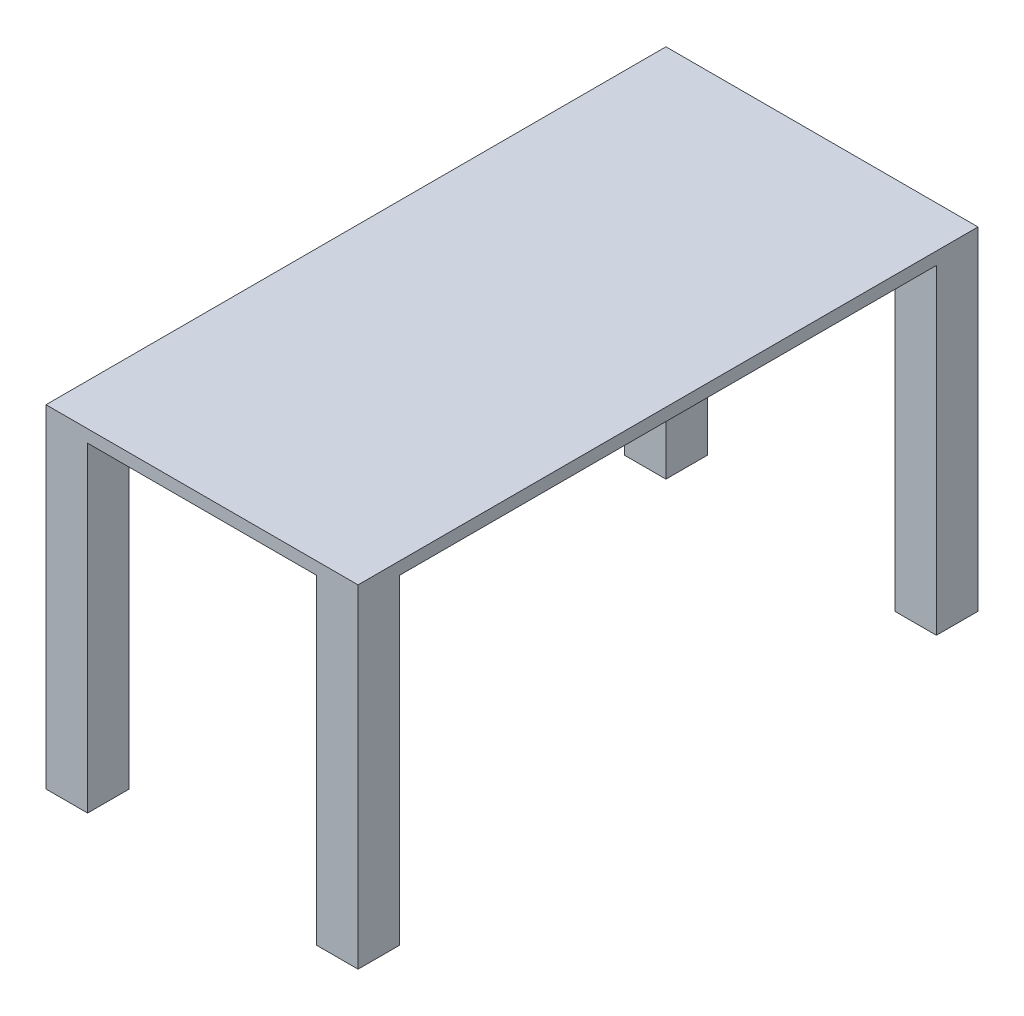
ISO-10303-21;
HEADER;
FILE_DESCRIPTION(('STEP AP214'),'2;1');
FILE_NAME('part.step','',(''),(''),'','','');
FILE_SCHEMA(('AUTOMOTIVE_DESIGN { 1 0 10303 214 1 1 1 1 }'));
ENDSEC;
DATA;
#1=APPLICATION_CONTEXT('core data for automotive mechanical design processes');
#2=APPLICATION_PROTOCOL_DEFINITION('international standard','automotive_design',2000,#1);
#3=PRODUCT_CONTEXT('',#1,'mechanical');
#4=PRODUCT('Part','Part','',(#3));
#5=PRODUCT_RELATED_PRODUCT_CATEGORY('part','',(#4));
#6=PRODUCT_DEFINITION_FORMATION('','',#4);
#7=PRODUCT_DEFINITION_CONTEXT('part definition',#1,'design');
#8=PRODUCT_DEFINITION('design','',#6,#7);
#9=PRODUCT_DEFINITION_SHAPE('','',#8);
#10=(LENGTH_UNIT() NAMED_UNIT(*) SI_UNIT(.MILLI.,.METRE.));
#11=(NAMED_UNIT(*) PLANE_ANGLE_UNIT() SI_UNIT($,.RADIAN.));
#12=(NAMED_UNIT(*) SI_UNIT($,.STERADIAN.) SOLID_ANGLE_UNIT());
#13=UNCERTAINTY_MEASURE_WITH_UNIT(LENGTH_MEASURE(1.E-05),#10,'distance_accuracy_value','');
#14=(GEOMETRIC_REPRESENTATION_CONTEXT(3) GLOBAL_UNCERTAINTY_ASSIGNED_CONTEXT((#13)) GLOBAL_UNIT_ASSIGNED_CONTEXT((#10,
#11,#12)) REPRESENTATION_CONTEXT('',''));
#15=CARTESIAN_POINT('',(0.,0.,0.));
#16=DIRECTION('',(0.,0.,1.));
#17=DIRECTION('',(1.,0.,0.));
#18=AXIS2_PLACEMENT_3D('',#15,#16,#17);
#19=CARTESIAN_POINT('',(0.,30.,0.));
#20=DIRECTION('',(1.,0.,0.));
#21=DIRECTION('',(0.,0.,-1.));
#22=AXIS2_PLACEMENT_3D('',#19,#20,#21);
#23=PLANE('',#22);
#24=DIRECTION('',(0.,-1.,0.));
#25=VECTOR('',#24,1.);
#26=CARTESIAN_POINT('',(0.,30.,0.));
#27=LINE('',#26,#25);
#28=CARTESIAN_POINT('',(0.,30.,0.));
#29=VERTEX_POINT('',#28);
#30=CARTESIAN_POINT('',(0.,-770.,0.));
#31=VERTEX_POINT('',#30);
#32=EDGE_CURVE('E255',#29,#31,#27,.T.);
#33=ORIENTED_EDGE('',*,*,#32,.F.);
#34=DIRECTION('',(0.,0.,1.));
#35=VECTOR('',#34,1.);
#36=CARTESIAN_POINT('',(0.,30.,0.));
#37=LINE('',#36,#35);
#38=CARTESIAN_POINT('',(0.,30.,-1490.));
#39=VERTEX_POINT('',#38);
#40=EDGE_CURVE('E152',#39,#29,#37,.T.);
#41=ORIENTED_EDGE('',*,*,#40,.F.);
#42=DIRECTION('',(0.,-1.,0.));
#43=VECTOR('',#42,1.);
#44=CARTESIAN_POINT('',(0.,30.,-1490.));
#45=LINE('',#44,#43);
#46=CARTESIAN_POINT('',(0.,-770.,-1490.));
#47=VERTEX_POINT('',#46);
#48=EDGE_CURVE('E148',#39,#47,#45,.T.);
#49=ORIENTED_EDGE('',*,*,#48,.T.);
#50=DIRECTION('',(0.,0.,1.));
#51=VECTOR('',#50,1.);
#52=CARTESIAN_POINT('',(0.,-770.,-1490.));
#53=LINE('',#52,#51);
#54=CARTESIAN_POINT('',(0.,-770.,-1390.));
#55=VERTEX_POINT('',#54);
#56=EDGE_CURVE('E151',#47,#55,#53,.T.);
#57=ORIENTED_EDGE('',*,*,#56,.T.);
#58=DIRECTION('',(0.,1.,0.));
#59=VECTOR('',#58,1.);
#60=CARTESIAN_POINT('',(0.,-770.,-1390.));
#61=LINE('',#60,#59);
#62=CARTESIAN_POINT('',(0.,0.,-1390.));
#63=VERTEX_POINT('',#62);
#64=EDGE_CURVE('E51',#55,#63,#61,.T.);
#65=ORIENTED_EDGE('',*,*,#64,.T.);
#66=DIRECTION('',(0.,0.,1.));
#67=VECTOR('',#66,1.);
#68=CARTESIAN_POINT('',(0.,0.,0.));
#69=LINE('',#68,#67);
#70=CARTESIAN_POINT('',(0.,0.,-100.));
#71=VERTEX_POINT('',#70);
#72=EDGE_CURVE('E232',#63,#71,#69,.T.);
#73=ORIENTED_EDGE('',*,*,#72,.T.);
#74=DIRECTION('',(0.,1.,0.));
#75=VECTOR('',#74,1.);
#76=CARTESIAN_POINT('',(0.,-770.,-100.));
#77=LINE('',#76,#75);
#78=CARTESIAN_POINT('',(0.,-770.,-100.));
#79=VERTEX_POINT('',#78);
#80=EDGE_CURVE('E229',#79,#71,#77,.T.);
#81=ORIENTED_EDGE('',*,*,#80,.F.);
#82=DIRECTION('',(0.,0.,1.));
#83=VECTOR('',#82,1.);
#84=CARTESIAN_POINT('',(0.,-770.,0.));
#85=LINE('',#84,#83);
#86=EDGE_CURVE('E212',#79,#31,#85,.T.);
#87=ORIENTED_EDGE('',*,*,#86,.T.);
#88=EDGE_LOOP('',(#33,#41,#49,#57,#65,#73,#81,#87));
#89=FACE_BOUND('',#88,.T.);
#90=ADVANCED_FACE('F37',(#89),#23,.F.);
#91=CARTESIAN_POINT('',(0.,30.,0.));
#92=DIRECTION('',(0.,0.,-1.));
#93=DIRECTION('',(-1.,0.,0.));
#94=AXIS2_PLACEMENT_3D('',#91,#92,#93);
#95=PLANE('',#94);
#96=DIRECTION('',(1.,0.,0.));
#97=VECTOR('',#96,1.);
#98=CARTESIAN_POINT('',(0.,0.,0.));
#99=LINE('',#98,#97);
#100=CARTESIAN_POINT('',(100.,0.,0.));
#101=VERTEX_POINT('',#100);
#102=CARTESIAN_POINT('',(650.,0.,0.));
#103=VERTEX_POINT('',#102);
#104=EDGE_CURVE('E245',#101,#103,#99,.T.);
#105=ORIENTED_EDGE('',*,*,#104,.T.);
#106=DIRECTION('',(0.,1.,0.));
#107=VECTOR('',#106,1.);
#108=CARTESIAN_POINT('',(650.,-770.,0.));
#109=LINE('',#108,#107);
#110=CARTESIAN_POINT('',(650.,-770.,0.));
#111=VERTEX_POINT('',#110);
#112=EDGE_CURVE('E210',#111,#103,#109,.T.);
#113=ORIENTED_EDGE('',*,*,#112,.F.);
#114=DIRECTION('',(1.,0.,0.));
#115=VECTOR('',#114,1.);
#116=CARTESIAN_POINT('',(750.,-770.,0.));
#117=LINE('',#116,#115);
#118=CARTESIAN_POINT('',(750.,-770.,0.));
#119=VERTEX_POINT('',#118);
#120=EDGE_CURVE('E193',#111,#119,#117,.T.);
#121=ORIENTED_EDGE('',*,*,#120,.T.);
#122=DIRECTION('',(0.,-1.,0.));
#123=VECTOR('',#122,1.);
#124=CARTESIAN_POINT('',(750.,30.,0.));
#125=LINE('',#124,#123);
#126=CARTESIAN_POINT('',(750.,30.,0.));
#127=VERTEX_POINT('',#126);
#128=EDGE_CURVE('E253',#127,#119,#125,.T.);
#129=ORIENTED_EDGE('',*,*,#128,.F.);
#130=DIRECTION('',(1.,0.,0.));
#131=VECTOR('',#130,1.);
#132=CARTESIAN_POINT('',(0.,30.,0.));
#133=LINE('',#132,#131);
#134=EDGE_CURVE('E238',#29,#127,#133,.T.);
#135=ORIENTED_EDGE('',*,*,#134,.F.);
#136=ORIENTED_EDGE('',*,*,#32,.T.);
#137=DIRECTION('',(1.,0.,0.));
#138=VECTOR('',#137,1.);
#139=CARTESIAN_POINT('',(0.,-770.,0.));
#140=LINE('',#139,#138);
#141=CARTESIAN_POINT('',(100.,-770.,0.));
#142=VERTEX_POINT('',#141);
#143=EDGE_CURVE('E219',#31,#142,#140,.T.);
#144=ORIENTED_EDGE('',*,*,#143,.T.);
#145=DIRECTION('',(0.,1.,0.));
#146=VECTOR('',#145,1.);
#147=CARTESIAN_POINT('',(100.,-770.,0.));
#148=LINE('',#147,#146);
#149=EDGE_CURVE('E228',#142,#101,#148,.T.);
#150=ORIENTED_EDGE('',*,*,#149,.T.);
#151=EDGE_LOOP('',(#105,#113,#121,#129,#135,#136,#144,#150));
#152=FACE_BOUND('',#151,.T.);
#153=ADVANCED_FACE('F289',(#152),#95,.F.);
#154=CARTESIAN_POINT('',(750.,30.,0.));
#155=DIRECTION('',(-1.,0.,0.));
#156=DIRECTION('',(0.,0.,1.));
#157=AXIS2_PLACEMENT_3D('',#154,#155,#156);
#158=PLANE('',#157);
#159=DIRECTION('',(0.,0.,-1.));
#160=VECTOR('',#159,1.);
#161=CARTESIAN_POINT('',(750.,0.,0.));
#162=LINE('',#161,#160);
#163=CARTESIAN_POINT('',(750.,0.,-100.));
#164=VERTEX_POINT('',#163);
#165=CARTESIAN_POINT('',(750.,0.,-1390.));
#166=VERTEX_POINT('',#165);
#167=EDGE_CURVE('E248',#164,#166,#162,.T.);
#168=ORIENTED_EDGE('',*,*,#167,.T.);
#169=DIRECTION('',(0.,1.,0.));
#170=VECTOR('',#169,1.);
#171=CARTESIAN_POINT('',(750.,-770.,-1390.));
#172=LINE('',#171,#170);
#173=CARTESIAN_POINT('',(750.,-770.,-1390.));
#174=VERTEX_POINT('',#173);
#175=EDGE_CURVE('E191',#174,#166,#172,.T.);
#176=ORIENTED_EDGE('',*,*,#175,.F.);
#177=DIRECTION('',(0.,0.,-1.));
#178=VECTOR('',#177,1.);
#179=CARTESIAN_POINT('',(750.,-770.,-1490.));
#180=LINE('',#179,#178);
#181=CARTESIAN_POINT('',(750.,-770.,-1490.));
#182=VERTEX_POINT('',#181);
#183=EDGE_CURVE('E176',#174,#182,#180,.T.);
#184=ORIENTED_EDGE('',*,*,#183,.T.);
#185=DIRECTION('',(0.,-1.,0.));
#186=VECTOR('',#185,1.);
#187=CARTESIAN_POINT('',(750.,30.,-1490.));
#188=LINE('',#187,#186);
#189=CARTESIAN_POINT('',(750.,30.,-1490.));
#190=VERTEX_POINT('',#189);
#191=EDGE_CURVE('E155',#190,#182,#188,.T.);
#192=ORIENTED_EDGE('',*,*,#191,.F.);
#193=DIRECTION('',(0.,0.,-1.));
#194=VECTOR('',#193,1.);
#195=CARTESIAN_POINT('',(750.,30.,0.));
#196=LINE('',#195,#194);
#197=EDGE_CURVE('E241',#127,#190,#196,.T.);
#198=ORIENTED_EDGE('',*,*,#197,.F.);
#199=ORIENTED_EDGE('',*,*,#128,.T.);
#200=DIRECTION('',(0.,0.,-1.));
#201=VECTOR('',#200,1.);
#202=CARTESIAN_POINT('',(750.,-770.,0.));
#203=LINE('',#202,#201);
#204=CARTESIAN_POINT('',(750.,-770.,-100.));
#205=VERTEX_POINT('',#204);
#206=EDGE_CURVE('E200',#119,#205,#203,.T.);
#207=ORIENTED_EDGE('',*,*,#206,.T.);
#208=DIRECTION('',(0.,1.,0.));
#209=VECTOR('',#208,1.);
#210=CARTESIAN_POINT('',(750.,-770.,-100.));
#211=LINE('',#210,#209);
#212=EDGE_CURVE('E209',#205,#164,#211,.T.);
#213=ORIENTED_EDGE('',*,*,#212,.T.);
#214=EDGE_LOOP('',(#168,#176,#184,#192,#198,#199,#207,#213));
#215=FACE_BOUND('',#214,.T.);
#216=ADVANCED_FACE('F302',(#215),#158,.F.);
#217=CARTESIAN_POINT('',(0.,30.,-1490.));
#218=DIRECTION('',(0.,0.,1.));
#219=DIRECTION('',(1.,0.,0.));
#220=AXIS2_PLACEMENT_3D('',#217,#218,#219);
#221=PLANE('',#220);
#222=DIRECTION('',(-1.,0.,0.));
#223=VECTOR('',#222,1.);
#224=CARTESIAN_POINT('',(0.,0.,-1490.));
#225=LINE('',#224,#223);
#226=CARTESIAN_POINT('',(650.,0.,-1490.));
#227=VERTEX_POINT('',#226);
#228=CARTESIAN_POINT('',(99.9999999999999,0.,-1490.));
#229=VERTEX_POINT('',#228);
#230=EDGE_CURVE('E239',#227,#229,#225,.T.);
#231=ORIENTED_EDGE('',*,*,#230,.T.);
#232=DIRECTION('',(0.,1.,0.));
#233=VECTOR('',#232,1.);
#234=CARTESIAN_POINT('',(99.9999999999999,-770.,-1490.));
#235=LINE('',#234,#233);
#236=CARTESIAN_POINT('',(99.9999999999999,-770.,-1490.));
#237=VERTEX_POINT('',#236);
#238=EDGE_CURVE('E169',#237,#229,#235,.T.);
#239=ORIENTED_EDGE('',*,*,#238,.F.);
#240=DIRECTION('',(-1.,0.,0.));
#241=VECTOR('',#240,1.);
#242=CARTESIAN_POINT('',(0.,-770.,-1490.));
#243=LINE('',#242,#241);
#244=EDGE_CURVE('E163',#237,#47,#243,.T.);
#245=ORIENTED_EDGE('',*,*,#244,.T.);
#246=ORIENTED_EDGE('',*,*,#48,.F.);
#247=DIRECTION('',(-1.,0.,0.));
#248=VECTOR('',#247,1.);
#249=CARTESIAN_POINT('',(0.,30.,-1490.));
#250=LINE('',#249,#248);
#251=EDGE_CURVE('E156',#190,#39,#250,.T.);
#252=ORIENTED_EDGE('',*,*,#251,.F.);
#253=ORIENTED_EDGE('',*,*,#191,.T.);
#254=DIRECTION('',(-1.,0.,0.));
#255=VECTOR('',#254,1.);
#256=CARTESIAN_POINT('',(750.,-770.,-1490.));
#257=LINE('',#256,#255);
#258=CARTESIAN_POINT('',(650.,-770.,-1490.));
#259=VERTEX_POINT('',#258);
#260=EDGE_CURVE('E183',#182,#259,#257,.T.);
#261=ORIENTED_EDGE('',*,*,#260,.T.);
#262=DIRECTION('',(0.,1.,0.));
#263=VECTOR('',#262,1.);
#264=CARTESIAN_POINT('',(650.,-770.,-1490.));
#265=LINE('',#264,#263);
#266=EDGE_CURVE('E59',#259,#227,#265,.T.);
#267=ORIENTED_EDGE('',*,*,#266,.T.);
#268=EDGE_LOOP('',(#231,#239,#245,#246,#252,#253,#261,#267));
#269=FACE_BOUND('',#268,.T.);
#270=ADVANCED_FACE('F168',(#269),#221,.F.);
#271=CARTESIAN_POINT('',(0.,30.,0.));
#272=DIRECTION('',(0.,-1.,0.));
#273=DIRECTION('',(0.,0.,-1.));
#274=AXIS2_PLACEMENT_3D('',#271,#272,#273);
#275=PLANE('',#274);
#276=ORIENTED_EDGE('',*,*,#251,.T.);
#277=ORIENTED_EDGE('',*,*,#40,.T.);
#278=ORIENTED_EDGE('',*,*,#134,.T.);
#279=ORIENTED_EDGE('',*,*,#197,.T.);
#280=EDGE_LOOP('',(#276,#277,#278,#279));
#281=FACE_BOUND('',#280,.T.);
#282=ADVANCED_FACE('F293',(#281),#275,.F.);
#283=CARTESIAN_POINT('',(0.,0.,0.));
#284=DIRECTION('',(0.,-1.,0.));
#285=DIRECTION('',(0.,0.,-1.));
#286=AXIS2_PLACEMENT_3D('',#283,#284,#285);
#287=PLANE('',#286);
#288=DIRECTION('',(0.,0.,1.));
#289=VECTOR('',#288,1.);
#290=CARTESIAN_POINT('',(99.9999999999999,0.,0.));
#291=LINE('',#290,#289);
#292=CARTESIAN_POINT('',(99.9999999999999,0.,-1390.));
#293=VERTEX_POINT('',#292);
#294=EDGE_CURVE('E11',#229,#293,#291,.T.);
#295=ORIENTED_EDGE('',*,*,#294,.F.);
#296=ORIENTED_EDGE('',*,*,#230,.F.);
#297=DIRECTION('',(0.,0.,-1.));
#298=VECTOR('',#297,1.);
#299=CARTESIAN_POINT('',(650.,0.,0.));
#300=LINE('',#299,#298);
#301=CARTESIAN_POINT('',(650.,0.,-1390.));
#302=VERTEX_POINT('',#301);
#303=EDGE_CURVE('E267',#302,#227,#300,.T.);
#304=ORIENTED_EDGE('',*,*,#303,.F.);
#305=DIRECTION('',(-1.,0.,0.));
#306=VECTOR('',#305,1.);
#307=CARTESIAN_POINT('',(0.,0.,-1390.));
#308=LINE('',#307,#306);
#309=EDGE_CURVE('E269',#166,#302,#308,.T.);
#310=ORIENTED_EDGE('',*,*,#309,.F.);
#311=ORIENTED_EDGE('',*,*,#167,.F.);
#312=DIRECTION('',(1.,0.,0.));
#313=VECTOR('',#312,1.);
#314=CARTESIAN_POINT('',(0.,0.,-100.));
#315=LINE('',#314,#313);
#316=CARTESIAN_POINT('',(650.,0.,-100.));
#317=VERTEX_POINT('',#316);
#318=EDGE_CURVE('E262',#317,#164,#315,.T.);
#319=ORIENTED_EDGE('',*,*,#318,.F.);
#320=DIRECTION('',(0.,0.,-1.));
#321=VECTOR('',#320,1.);
#322=CARTESIAN_POINT('',(650.,0.,0.));
#323=LINE('',#322,#321);
#324=EDGE_CURVE('E265',#103,#317,#323,.T.);
#325=ORIENTED_EDGE('',*,*,#324,.F.);
#326=ORIENTED_EDGE('',*,*,#104,.F.);
#327=DIRECTION('',(0.,0.,1.));
#328=VECTOR('',#327,1.);
#329=CARTESIAN_POINT('',(100.,0.,0.));
#330=LINE('',#329,#328);
#331=CARTESIAN_POINT('',(100.,0.,-100.));
#332=VERTEX_POINT('',#331);
#333=EDGE_CURVE('E257',#332,#101,#330,.T.);
#334=ORIENTED_EDGE('',*,*,#333,.F.);
#335=DIRECTION('',(1.,0.,0.));
#336=VECTOR('',#335,1.);
#337=CARTESIAN_POINT('',(0.,0.,-100.));
#338=LINE('',#337,#336);
#339=EDGE_CURVE('E260',#71,#332,#338,.T.);
#340=ORIENTED_EDGE('',*,*,#339,.F.);
#341=ORIENTED_EDGE('',*,*,#72,.F.);
#342=DIRECTION('',(-1.,0.,0.));
#343=VECTOR('',#342,1.);
#344=CARTESIAN_POINT('',(0.,0.,-1390.));
#345=LINE('',#344,#343);
#346=EDGE_CURVE('E44',#293,#63,#345,.T.);
#347=ORIENTED_EDGE('',*,*,#346,.F.);
#348=EDGE_LOOP('',(#295,#296,#304,#310,#311,#319,#325,#326,#334,#340,#341,#347));
#349=FACE_BOUND('',#348,.T.);
#350=ADVANCED_FACE('F277',(#349),#287,.T.);
#351=CARTESIAN_POINT('',(0.,-770.,-100.));
#352=DIRECTION('',(0.,0.,-1.));
#353=DIRECTION('',(-1.,0.,0.));
#354=AXIS2_PLACEMENT_3D('',#351,#352,#353);
#355=PLANE('',#354);
#356=ORIENTED_EDGE('',*,*,#80,.T.);
#357=ORIENTED_EDGE('',*,*,#339,.T.);
#358=DIRECTION('',(0.,1.,0.));
#359=VECTOR('',#358,1.);
#360=CARTESIAN_POINT('',(100.,-770.,-100.));
#361=LINE('',#360,#359);
#362=CARTESIAN_POINT('',(100.,-770.,-100.));
#363=VERTEX_POINT('',#362);
#364=EDGE_CURVE('E233',#363,#332,#361,.T.);
#365=ORIENTED_EDGE('',*,*,#364,.F.);
#366=DIRECTION('',(-1.,0.,0.));
#367=VECTOR('',#366,1.);
#368=CARTESIAN_POINT('',(0.,-770.,-100.));
#369=LINE('',#368,#367);
#370=EDGE_CURVE('E225',#363,#79,#369,.T.);
#371=ORIENTED_EDGE('',*,*,#370,.T.);
#372=EDGE_LOOP('',(#356,#357,#365,#371));
#373=FACE_BOUND('',#372,.T.);
#374=ADVANCED_FACE('F281',(#373),#355,.T.);
#375=CARTESIAN_POINT('',(100.,-770.,0.));
#376=DIRECTION('',(1.,0.,0.));
#377=DIRECTION('',(0.,0.,-1.));
#378=AXIS2_PLACEMENT_3D('',#375,#376,#377);
#379=PLANE('',#378);
#380=ORIENTED_EDGE('',*,*,#364,.T.);
#381=ORIENTED_EDGE('',*,*,#333,.T.);
#382=ORIENTED_EDGE('',*,*,#149,.F.);
#383=DIRECTION('',(0.,0.,-1.));
#384=VECTOR('',#383,1.);
#385=CARTESIAN_POINT('',(100.,-770.,0.));
#386=LINE('',#385,#384);
#387=EDGE_CURVE('E222',#142,#363,#386,.T.);
#388=ORIENTED_EDGE('',*,*,#387,.T.);
#389=EDGE_LOOP('',(#380,#381,#382,#388));
#390=FACE_BOUND('',#389,.T.);
#391=ADVANCED_FACE('F339',(#390),#379,.T.);
#392=CARTESIAN_POINT('',(0.,-770.,0.));
#393=DIRECTION('',(0.,-1.,0.));
#394=DIRECTION('',(0.,0.,-1.));
#395=AXIS2_PLACEMENT_3D('',#392,#393,#394);
#396=PLANE('',#395);
#397=ORIENTED_EDGE('',*,*,#86,.F.);
#398=ORIENTED_EDGE('',*,*,#370,.F.);
#399=ORIENTED_EDGE('',*,*,#387,.F.);
#400=ORIENTED_EDGE('',*,*,#143,.F.);
#401=EDGE_LOOP('',(#397,#398,#399,#400));
#402=FACE_BOUND('',#401,.T.);
#403=ADVANCED_FACE('F285',(#402),#396,.T.);
#404=CARTESIAN_POINT('',(650.,-770.,0.));
#405=DIRECTION('',(-1.,0.,0.));
#406=DIRECTION('',(0.,0.,1.));
#407=AXIS2_PLACEMENT_3D('',#404,#405,#406);
#408=PLANE('',#407);
#409=ORIENTED_EDGE('',*,*,#112,.T.);
#410=ORIENTED_EDGE('',*,*,#324,.T.);
#411=DIRECTION('',(0.,1.,0.));
#412=VECTOR('',#411,1.);
#413=CARTESIAN_POINT('',(650.,-770.,-100.));
#414=LINE('',#413,#412);
#415=CARTESIAN_POINT('',(650.,-770.,-100.));
#416=VERTEX_POINT('',#415);
#417=EDGE_CURVE('E213',#416,#317,#414,.T.);
#418=ORIENTED_EDGE('',*,*,#417,.F.);
#419=DIRECTION('',(0.,0.,1.));
#420=VECTOR('',#419,1.);
#421=CARTESIAN_POINT('',(650.,-770.,0.));
#422=LINE('',#421,#420);
#423=EDGE_CURVE('E206',#416,#111,#422,.T.);
#424=ORIENTED_EDGE('',*,*,#423,.T.);
#425=EDGE_LOOP('',(#409,#410,#418,#424));
#426=FACE_BOUND('',#425,.T.);
#427=ADVANCED_FACE('F347',(#426),#408,.T.);
#428=CARTESIAN_POINT('',(750.,-770.,-100.));
#429=DIRECTION('',(0.,0.,-1.));
#430=DIRECTION('',(-1.,0.,0.));
#431=AXIS2_PLACEMENT_3D('',#428,#429,#430);
#432=PLANE('',#431);
#433=ORIENTED_EDGE('',*,*,#417,.T.);
#434=ORIENTED_EDGE('',*,*,#318,.T.);
#435=ORIENTED_EDGE('',*,*,#212,.F.);
#436=DIRECTION('',(-1.,0.,0.));
#437=VECTOR('',#436,1.);
#438=CARTESIAN_POINT('',(750.,-770.,-100.));
#439=LINE('',#438,#437);
#440=EDGE_CURVE('E203',#205,#416,#439,.T.);
#441=ORIENTED_EDGE('',*,*,#440,.T.);
#442=EDGE_LOOP('',(#433,#434,#435,#441));
#443=FACE_BOUND('',#442,.T.);
#444=ADVANCED_FACE('F348',(#443),#432,.T.);
#445=CARTESIAN_POINT('',(0.,-770.,0.));
#446=DIRECTION('',(0.,-1.,0.));
#447=DIRECTION('',(0.,0.,-1.));
#448=AXIS2_PLACEMENT_3D('',#445,#446,#447);
#449=PLANE('',#448);
#450=ORIENTED_EDGE('',*,*,#120,.F.);
#451=ORIENTED_EDGE('',*,*,#423,.F.);
#452=ORIENTED_EDGE('',*,*,#440,.F.);
#453=ORIENTED_EDGE('',*,*,#206,.F.);
#454=EDGE_LOOP('',(#450,#451,#452,#453));
#455=FACE_BOUND('',#454,.T.);
#456=ADVANCED_FACE('F320',(#455),#449,.T.);
#457=CARTESIAN_POINT('',(750.,-770.,-1390.));
#458=DIRECTION('',(0.,0.,1.));
#459=DIRECTION('',(1.,0.,0.));
#460=AXIS2_PLACEMENT_3D('',#457,#458,#459);
#461=PLANE('',#460);
#462=ORIENTED_EDGE('',*,*,#175,.T.);
#463=ORIENTED_EDGE('',*,*,#309,.T.);
#464=DIRECTION('',(0.,1.,0.));
#465=VECTOR('',#464,1.);
#466=CARTESIAN_POINT('',(650.,-770.,-1390.));
#467=LINE('',#466,#465);
#468=CARTESIAN_POINT('',(650.,-770.,-1390.));
#469=VERTEX_POINT('',#468);
#470=EDGE_CURVE('E194',#469,#302,#467,.T.);
#471=ORIENTED_EDGE('',*,*,#470,.F.);
#472=DIRECTION('',(1.,0.,0.));
#473=VECTOR('',#472,1.);
#474=CARTESIAN_POINT('',(750.,-770.,-1390.));
#475=LINE('',#474,#473);
#476=EDGE_CURVE('E188',#469,#174,#475,.T.);
#477=ORIENTED_EDGE('',*,*,#476,.T.);
#478=EDGE_LOOP('',(#462,#463,#471,#477));
#479=FACE_BOUND('',#478,.T.);
#480=ADVANCED_FACE('F306',(#479),#461,.T.);
#481=CARTESIAN_POINT('',(650.,-770.,-1490.));
#482=DIRECTION('',(-1.,0.,0.));
#483=DIRECTION('',(0.,0.,1.));
#484=AXIS2_PLACEMENT_3D('',#481,#482,#483);
#485=PLANE('',#484);
#486=ORIENTED_EDGE('',*,*,#470,.T.);
#487=ORIENTED_EDGE('',*,*,#303,.T.);
#488=ORIENTED_EDGE('',*,*,#266,.F.);
#489=DIRECTION('',(0.,0.,1.));
#490=VECTOR('',#489,1.);
#491=CARTESIAN_POINT('',(650.,-770.,-1490.));
#492=LINE('',#491,#490);
#493=EDGE_CURVE('E185',#259,#469,#492,.T.);
#494=ORIENTED_EDGE('',*,*,#493,.T.);
#495=EDGE_LOOP('',(#486,#487,#488,#494));
#496=FACE_BOUND('',#495,.T.);
#497=ADVANCED_FACE('F311',(#496),#485,.T.);
#498=CARTESIAN_POINT('',(0.,-770.,0.));
#499=DIRECTION('',(0.,-1.,0.));
#500=DIRECTION('',(0.,0.,-1.));
#501=AXIS2_PLACEMENT_3D('',#498,#499,#500);
#502=PLANE('',#501);
#503=ORIENTED_EDGE('',*,*,#183,.F.);
#504=ORIENTED_EDGE('',*,*,#476,.F.);
#505=ORIENTED_EDGE('',*,*,#493,.F.);
#506=ORIENTED_EDGE('',*,*,#260,.F.);
#507=EDGE_LOOP('',(#503,#504,#505,#506));
#508=FACE_BOUND('',#507,.T.);
#509=ADVANCED_FACE('F300',(#508),#502,.T.);
#510=CARTESIAN_POINT('',(99.9999999999999,-770.,-1490.));
#511=DIRECTION('',(1.,0.,0.));
#512=DIRECTION('',(0.,0.,-1.));
#513=AXIS2_PLACEMENT_3D('',#510,#511,#512);
#514=PLANE('',#513);
#515=ORIENTED_EDGE('',*,*,#238,.T.);
#516=ORIENTED_EDGE('',*,*,#294,.T.);
#517=DIRECTION('',(0.,1.,0.));
#518=VECTOR('',#517,1.);
#519=CARTESIAN_POINT('',(99.9999999999999,-770.,-1390.));
#520=LINE('',#519,#518);
#521=CARTESIAN_POINT('',(99.9999999999999,-770.,-1390.));
#522=VERTEX_POINT('',#521);
#523=EDGE_CURVE('E177',#522,#293,#520,.T.);
#524=ORIENTED_EDGE('',*,*,#523,.F.);
#525=DIRECTION('',(0.,0.,-1.));
#526=VECTOR('',#525,1.);
#527=CARTESIAN_POINT('',(99.9999999999999,-770.,-1490.));
#528=LINE('',#527,#526);
#529=EDGE_CURVE('E173',#522,#237,#528,.T.);
#530=ORIENTED_EDGE('',*,*,#529,.T.);
#531=EDGE_LOOP('',(#515,#516,#524,#530));
#532=FACE_BOUND('',#531,.T.);
#533=ADVANCED_FACE('F318',(#532),#514,.T.);
#534=CARTESIAN_POINT('',(0.,-770.,-1390.));
#535=DIRECTION('',(0.,0.,1.));
#536=DIRECTION('',(1.,0.,0.));
#537=AXIS2_PLACEMENT_3D('',#534,#535,#536);
#538=PLANE('',#537);
#539=ORIENTED_EDGE('',*,*,#523,.T.);
#540=ORIENTED_EDGE('',*,*,#346,.T.);
#541=ORIENTED_EDGE('',*,*,#64,.F.);
#542=DIRECTION('',(1.,0.,0.));
#543=VECTOR('',#542,1.);
#544=CARTESIAN_POINT('',(0.,-770.,-1390.));
#545=LINE('',#544,#543);
#546=EDGE_CURVE('E166',#55,#522,#545,.T.);
#547=ORIENTED_EDGE('',*,*,#546,.T.);
#548=EDGE_LOOP('',(#539,#540,#541,#547));
#549=FACE_BOUND('',#548,.T.);
#550=ADVANCED_FACE('F273',(#549),#538,.T.);
#551=CARTESIAN_POINT('',(0.,-770.,0.));
#552=DIRECTION('',(0.,-1.,0.));
#553=DIRECTION('',(0.,0.,-1.));
#554=AXIS2_PLACEMENT_3D('',#551,#552,#553);
#555=PLANE('',#554);
#556=ORIENTED_EDGE('',*,*,#244,.F.);
#557=ORIENTED_EDGE('',*,*,#529,.F.);
#558=ORIENTED_EDGE('',*,*,#546,.F.);
#559=ORIENTED_EDGE('',*,*,#56,.F.);
#560=EDGE_LOOP('',(#556,#557,#558,#559));
#561=FACE_BOUND('',#560,.T.);
#562=ADVANCED_FACE('F161',(#561),#555,.T.);
#563=CLOSED_SHELL('',(#90,#153,#216,#270,#282,#350,#374,#391,#403,#427,#444,#456,#480,#497,#509,
#533,#550,#562));
#564=MANIFOLD_SOLID_BREP('B2',#563);
#565=ADVANCED_BREP_SHAPE_REPRESENTATION('',(#18,#564),#14);
#566=SHAPE_DEFINITION_REPRESENTATION(#9,#565);
ENDSEC;
END-ISO-10303-21;
